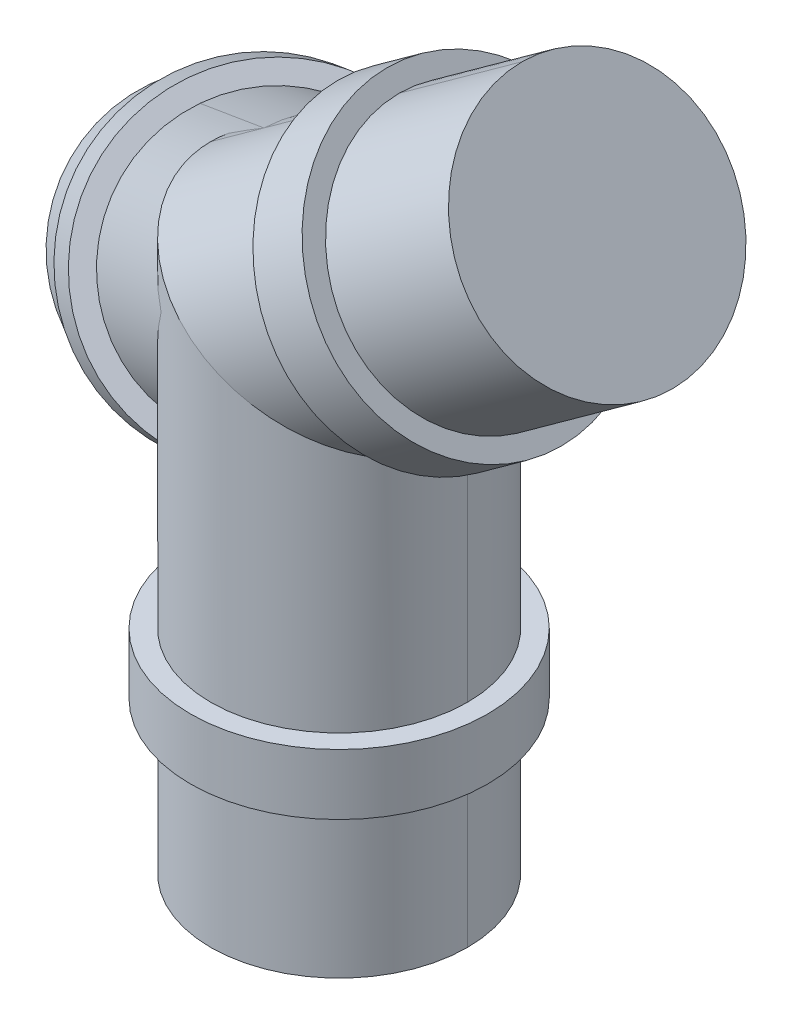
ISO-10303-21;
HEADER;
FILE_DESCRIPTION(('STEP AP214'),'2;1');
FILE_NAME('part.step','',(''),(''),'','','');
FILE_SCHEMA(('AUTOMOTIVE_DESIGN { 1 0 10303 214 1 1 1 1 }'));
ENDSEC;
DATA;
#1=APPLICATION_CONTEXT('core data for automotive mechanical design processes');
#2=APPLICATION_PROTOCOL_DEFINITION('international standard','automotive_design',2000,#1);
#3=PRODUCT_CONTEXT('',#1,'mechanical');
#4=PRODUCT('Part','Part','',(#3));
#5=PRODUCT_RELATED_PRODUCT_CATEGORY('part','',(#4));
#6=PRODUCT_DEFINITION_FORMATION('','',#4);
#7=PRODUCT_DEFINITION_CONTEXT('part definition',#1,'design');
#8=PRODUCT_DEFINITION('design','',#6,#7);
#9=PRODUCT_DEFINITION_SHAPE('','',#8);
#10=(LENGTH_UNIT() NAMED_UNIT(*) SI_UNIT(.MILLI.,.METRE.));
#11=(NAMED_UNIT(*) PLANE_ANGLE_UNIT() SI_UNIT($,.RADIAN.));
#12=(NAMED_UNIT(*) SI_UNIT($,.STERADIAN.) SOLID_ANGLE_UNIT());
#13=UNCERTAINTY_MEASURE_WITH_UNIT(LENGTH_MEASURE(1.E-05),#10,'distance_accuracy_value','');
#14=(GEOMETRIC_REPRESENTATION_CONTEXT(3) GLOBAL_UNCERTAINTY_ASSIGNED_CONTEXT((#13)) GLOBAL_UNIT_ASSIGNED_CONTEXT((#10,
#11,#12)) REPRESENTATION_CONTEXT('',''));
#15=CARTESIAN_POINT('',(0.,0.,0.));
#16=DIRECTION('',(0.,0.,1.));
#17=DIRECTION('',(1.,0.,0.));
#18=AXIS2_PLACEMENT_3D('',#15,#16,#17);
#19=CARTESIAN_POINT('',(87.4499312465951,2599.77665939185,4064.45483546757));
#20=DIRECTION('',(0.81067922839988,0.585490553844359,0.));
#21=DIRECTION('',(-0.585490553844359,0.81067922839988,0.));
#22=AXIS2_PLACEMENT_3D('',#19,#20,#21);
#23=CYLINDRICAL_SURFACE('',#22,12.7);
#24=DIRECTION('',(0.810679228399881,0.585490553844358,0.));
#25=VECTOR('',#24,1.);
#26=CARTESIAN_POINT('',(80.0142012127719,2610.07228559253,4064.45483546757));
#27=LINE('',#26,#25);
#28=CARTESIAN_POINT('',(91.6766630611999,2618.49517470528,4064.45483546757));
#29=VERTEX_POINT('',#28);
#30=CARTESIAN_POINT('',(100.183649940978,2624.63910967401,4064.45483546757));
#31=VERTEX_POINT('',#30);
#32=EDGE_CURVE('E170',#29,#31,#27,.T.);
#33=ORIENTED_EDGE('',*,*,#32,.T.);
#34=CARTESIAN_POINT('',(107.6193799748,2614.34348347333,4064.45483546757));
#35=DIRECTION('',(0.810679228399886,0.585490553844352,0.));
#36=DIRECTION('',(-0.585490553844352,0.810679228399886,0.));
#37=AXIS2_PLACEMENT_3D('',#34,#35,#36);
#38=CIRCLE('',#37,12.6999999999995);
#39=CARTESIAN_POINT('',(115.055110008623,2604.04785727265,4064.45483546757));
#40=VERTEX_POINT('',#39);
#41=EDGE_CURVE('E61',#40,#31,#38,.T.);
#42=ORIENTED_EDGE('',*,*,#41,.F.);
#43=DIRECTION('',(0.810679228399881,0.585490553844358,0.));
#44=VECTOR('',#43,1.);
#45=CARTESIAN_POINT('',(94.885661280418,2589.48103319117,4064.45483546757));
#46=LINE('',#45,#44);
#47=CARTESIAN_POINT('',(111.812393095024,2601.70589505728,4064.45483546757));
#48=VERTEX_POINT('',#47);
#49=EDGE_CURVE('E238',#48,#40,#46,.T.);
#50=ORIENTED_EDGE('',*,*,#49,.F.);
#51=CARTESIAN_POINT('',(104.743551235697,2605.32027374298,4053.07151178796));
#52=CARTESIAN_POINT('',(109.193389339506,2603.04502125929,4055.27277942896));
#53=CARTESIAN_POINT('',(111.812393095024,2601.70589505728,4059.49029738458));
#54=CARTESIAN_POINT('',(111.812393095024,2601.70589505728,4064.45483546757));
#55=(BOUNDED_CURVE() B_SPLINE_CURVE(3,(#51,#52,#53,#54),.UNSPECIFIED.,.F.,
.F.) B_SPLINE_CURVE_WITH_KNOTS((4,4),(2.03018280843935,3.1415926535898),
.UNSPECIFIED.) CURVE() GEOMETRIC_REPRESENTATION_ITEM() RATIONAL_B_SPLINE_CURVE((1.,
0.899685849938622,0.899685849938622,1.)) REPRESENTATION_ITEM(''));
#56=CARTESIAN_POINT('',(104.743551235697,2605.32027374298,4053.07151178796));
#57=VERTEX_POINT('',#56);
#58=EDGE_CURVE('E254',#57,#48,#55,.T.);
#59=ORIENTED_EDGE('',*,*,#58,.F.);
#60=CARTESIAN_POINT('',(91.6766630611999,2618.49517470528,4064.45483546757));
#61=CARTESIAN_POINT('',(93.8296687804929,2620.05012328033,4053.95500921483));
#62=CARTESIAN_POINT('',(100.187990178871,2613.63924307752,4048.41590689987));
#63=CARTESIAN_POINT('',(104.743551235697,2605.32027374298,4053.07151178796));
#64=(BOUNDED_CURVE() B_SPLINE_CURVE(3,(#60,#61,#62,#63),.UNSPECIFIED.,.F.,
.F.) B_SPLINE_CURVE_WITH_KNOTS((4,4),(4.71238898038472,6.74257178882402),
.UNSPECIFIED.) CURVE() GEOMETRIC_REPRESENTATION_ITEM() RATIONAL_B_SPLINE_CURVE((1.,
0.685028188825005,0.685028188825005,1.)) REPRESENTATION_ITEM(''));
#65=EDGE_CURVE('E239',#29,#57,#64,.T.);
#66=ORIENTED_EDGE('',*,*,#65,.F.);
#67=EDGE_LOOP('',(#33,#42,#50,#59,#66));
#68=FACE_BOUND('',#67,.T.);
#69=ADVANCED_FACE('F39',(#68),#23,.T.);
#70=CARTESIAN_POINT('',(87.4499312465951,2599.77665939185,4064.45483546757));
#71=DIRECTION('',(0.81067922839988,0.585490553844359,0.));
#72=DIRECTION('',(-0.585490553844359,0.81067922839988,0.));
#73=AXIS2_PLACEMENT_3D('',#70,#71,#72);
#74=CYLINDRICAL_SURFACE('',#73,12.7);
#75=ORIENTED_EDGE('',*,*,#49,.T.);
#76=EDGE_CURVE('E181',#31,#40,#38,.T.);
#77=ORIENTED_EDGE('',*,*,#76,.F.);
#78=ORIENTED_EDGE('',*,*,#32,.F.);
#79=DIRECTION('',(0.810679228399881,0.585490553844358,0.));
#80=VECTOR('',#79,1.);
#81=CARTESIAN_POINT('',(80.0142012127719,2610.07228559253,4064.45483546757));
#82=LINE('',#81,#80);
#83=CARTESIAN_POINT('',(86.412393095024,2614.69320195193,4064.45483546757));
#84=VERTEX_POINT('',#83);
#85=EDGE_CURVE('E295',#84,#29,#82,.T.);
#86=ORIENTED_EDGE('',*,*,#85,.F.);
#87=CARTESIAN_POINT('',(111.812393095024,2601.70589505728,4064.45483546757));
#88=CARTESIAN_POINT('',(111.812393095024,2601.70589505727,4089.85483546757));
#89=CARTESIAN_POINT('',(86.4123930950245,2614.69320195193,4089.85483546757));
#90=CARTESIAN_POINT('',(86.412393095024,2614.69320195193,4064.45483546757));
#91=(BOUNDED_CURVE() B_SPLINE_CURVE(3,(#87,#88,#89,#90),.UNSPECIFIED.,.F.,
.F.) B_SPLINE_CURVE_WITH_KNOTS((4,4),(3.1415926535898,6.28318530717959),
.UNSPECIFIED.) CURVE() GEOMETRIC_REPRESENTATION_ITEM() RATIONAL_B_SPLINE_CURVE((1.,
0.333333333333334,0.333333333333334,1.)) REPRESENTATION_ITEM(''));
#92=EDGE_CURVE('E277',#48,#84,#91,.T.);
#93=ORIENTED_EDGE('',*,*,#92,.F.);
#94=EDGE_LOOP('',(#75,#77,#78,#86,#93));
#95=FACE_BOUND('',#94,.T.);
#96=ADVANCED_FACE('F385',(#95),#74,.T.);
#97=CARTESIAN_POINT('',(99.1123930950239,2063.49288183794,4064.45483546757));
#98=DIRECTION('',(0.,1.,0.));
#99=DIRECTION('',(-1.,0.,0.));
#100=AXIS2_PLACEMENT_3D('',#97,#98,#99);
#101=CYLINDRICAL_SURFACE('',#100,12.7);
#102=DIRECTION('',(0.,1.,0.));
#103=VECTOR('',#102,1.);
#104=CARTESIAN_POINT('',(86.412393095024,2063.49288183794,4064.45483546757));
#105=LINE('',#104,#103);
#106=CARTESIAN_POINT('',(86.4123930950239,2579.36145061283,4064.45483546757));
#107=VERTEX_POINT('',#106);
#108=CARTESIAN_POINT('',(86.412393095024,2589.5213366435,4064.45483546757));
#109=VERTEX_POINT('',#108);
#110=EDGE_CURVE('E252',#107,#109,#105,.T.);
#111=ORIENTED_EDGE('',*,*,#110,.F.);
#112=CARTESIAN_POINT('',(99.1123930950238,2579.36145061283,4064.45483546757));
#113=DIRECTION('',(0.,-1.,0.));
#114=DIRECTION('',(0.,0.,-1.));
#115=AXIS2_PLACEMENT_3D('',#112,#113,#114);
#116=CIRCLE('',#115,12.7000000000001);
#117=CARTESIAN_POINT('',(111.812393095024,2579.36145061283,4064.45483546757));
#118=VERTEX_POINT('',#117);
#119=EDGE_CURVE('E191',#118,#107,#116,.T.);
#120=ORIENTED_EDGE('',*,*,#119,.F.);
#121=DIRECTION('',(0.,1.,0.));
#122=VECTOR('',#121,1.);
#123=CARTESIAN_POINT('',(111.812393095024,2063.49288183794,4064.45483546757));
#124=LINE('',#123,#122);
#125=EDGE_CURVE('E308',#118,#48,#124,.T.);
#126=ORIENTED_EDGE('',*,*,#125,.T.);
#127=ORIENTED_EDGE('',*,*,#92,.T.);
#128=DIRECTION('',(0.,1.,0.));
#129=VECTOR('',#128,1.);
#130=CARTESIAN_POINT('',(86.412393095024,2063.49288183794,4064.45483546757));
#131=LINE('',#130,#129);
#132=CARTESIAN_POINT('',(86.412393095024,2614.17776036571,4064.45483546757));
#133=VERTEX_POINT('',#132);
#134=EDGE_CURVE('E237',#133,#84,#131,.T.);
#135=ORIENTED_EDGE('',*,*,#134,.F.);
#136=CARTESIAN_POINT('',(92.0677006029631,2608.1995485046,4075.02187420566));
#137=CARTESIAN_POINT('',(88.4589341232012,2610.65328094076,4072.61602988582));
#138=CARTESIAN_POINT('',(86.4123930950239,2612.81667450189,4068.79203299555));
#139=CARTESIAN_POINT('',(86.412393095024,2614.17776036571,4064.45483546757));
#140=(BOUNDED_CURVE() B_SPLINE_CURVE(3,(#136,#137,#138,#139),.UNSPECIFIED.,.F.,
.F.) B_SPLINE_CURVE_WITH_KNOTS((4,4),(4.71238898038468,5.69518270363202),
.UNSPECIFIED.) CURVE() GEOMETRIC_REPRESENTATION_ITEM() RATIONAL_B_SPLINE_CURVE((1.,
0.921116399178628,0.921116399178628,1.)) REPRESENTATION_ITEM(''));
#141=CARTESIAN_POINT('',(92.0677006029631,2608.1995485046,4075.02187420566));
#142=VERTEX_POINT('',#141);
#143=EDGE_CURVE('E286',#142,#133,#140,.T.);
#144=ORIENTED_EDGE('',*,*,#143,.F.);
#145=CARTESIAN_POINT('',(86.412393095024,2589.5213366435,4064.45483546757));
#146=CARTESIAN_POINT('',(86.4123930950237,2593.77388752597,4068.79203299555));
#147=CARTESIAN_POINT('',(88.458934123201,2600.53315337546,4072.61602988582));
#148=CARTESIAN_POINT('',(92.0677006029631,2608.1995485046,4075.02187420566));
#149=(BOUNDED_CURVE() B_SPLINE_CURVE(3,(#145,#146,#147,#148),.UNSPECIFIED.,.F.,
.F.) B_SPLINE_CURVE_WITH_KNOTS((4,4),(3.72959525713736,4.71238898038469),
.UNSPECIFIED.) CURVE() GEOMETRIC_REPRESENTATION_ITEM() RATIONAL_B_SPLINE_CURVE((1.,
0.921116399178629,0.921116399178629,1.)) REPRESENTATION_ITEM(''));
#150=EDGE_CURVE('E270',#109,#142,#149,.T.);
#151=ORIENTED_EDGE('',*,*,#150,.F.);
#152=EDGE_LOOP('',(#111,#120,#126,#127,#135,#144,#151));
#153=FACE_BOUND('',#152,.T.);
#154=ADVANCED_FACE('F392',(#153),#101,.T.);
#155=CARTESIAN_POINT('',(99.1123930950239,2063.49288183794,4064.45483546757));
#156=DIRECTION('',(0.,1.,0.));
#157=DIRECTION('',(-1.,0.,0.));
#158=AXIS2_PLACEMENT_3D('',#155,#156,#157);
#159=CYLINDRICAL_SURFACE('',#158,12.7);
#160=ORIENTED_EDGE('',*,*,#125,.F.);
#161=CARTESIAN_POINT('',(99.1123930950238,2579.36145061283,4064.45483546757));
#162=DIRECTION('',(0.,-1.,0.));
#163=DIRECTION('',(0.,0.,-1.));
#164=AXIS2_PLACEMENT_3D('',#161,#162,#163);
#165=CIRCLE('',#164,12.7);
#166=EDGE_CURVE('E11',#118,#107,#165,.F.);
#167=ORIENTED_EDGE('',*,*,#166,.T.);
#168=ORIENTED_EDGE('',*,*,#110,.T.);
#169=CARTESIAN_POINT('',(91.406084749396,2586.96800569654,4054.3601432146));
#170=CARTESIAN_POINT('',(88.2005486928214,2584.65289632235,4056.80725587994));
#171=CARTESIAN_POINT('',(86.4123930950238,2585.56720047684,4060.42199257367));
#172=CARTESIAN_POINT('',(86.412393095024,2589.5213366435,4064.45483546757));
#173=(BOUNDED_CURVE() B_SPLINE_CURVE(3,(#169,#170,#171,#172),.UNSPECIFIED.,.F.,
.F.) B_SPLINE_CURVE_WITH_KNOTS((4,4),(2.81082229384849,3.72959525713736),
.UNSPECIFIED.) CURVE() GEOMETRIC_REPRESENTATION_ITEM() RATIONAL_B_SPLINE_CURVE((1.,
0.930883132787844,0.930883132787844,1.)) REPRESENTATION_ITEM(''));
#174=CARTESIAN_POINT('',(91.406084749396,2586.96800569654,4054.3601432146));
#175=VERTEX_POINT('',#174);
#176=EDGE_CURVE('E260',#175,#109,#173,.T.);
#177=ORIENTED_EDGE('',*,*,#176,.F.);
#178=CARTESIAN_POINT('',(104.743551235697,2605.32027374298,4053.07151178796));
#179=CARTESIAN_POINT('',(100.293713131887,2596.61747733157,4050.87024414696));
#180=CARTESIAN_POINT('',(95.3521858616709,2589.81796761096,4051.34768169798));
#181=CARTESIAN_POINT('',(91.406084749396,2586.96800569654,4054.3601432146));
#182=(BOUNDED_CURVE() B_SPLINE_CURVE(3,(#178,#179,#180,#181),.UNSPECIFIED.,.F.,
.F.) B_SPLINE_CURVE_WITH_KNOTS((4,4),(1.69941244869801,2.81082229384849),
.UNSPECIFIED.) CURVE() GEOMETRIC_REPRESENTATION_ITEM() RATIONAL_B_SPLINE_CURVE((1.,
0.899685849938618,0.899685849938618,1.)) REPRESENTATION_ITEM(''));
#183=EDGE_CURVE('E230',#57,#175,#182,.T.);
#184=ORIENTED_EDGE('',*,*,#183,.F.);
#185=ORIENTED_EDGE('',*,*,#58,.T.);
#186=EDGE_LOOP('',(#160,#167,#168,#177,#184,#185));
#187=FACE_BOUND('',#186,.T.);
#188=ADVANCED_FACE('F378',(#187),#159,.T.);
#189=CARTESIAN_POINT('',(99.1123930950239,2063.49288183794,4064.45483546757));
#190=DIRECTION('',(0.,1.,0.));
#191=DIRECTION('',(-1.,0.,0.));
#192=AXIS2_PLACEMENT_3D('',#189,#190,#191);
#193=CYLINDRICAL_SURFACE('',#192,12.7);
#194=CARTESIAN_POINT('',(86.412393095024,2614.17776036571,4064.45483546757));
#195=CARTESIAN_POINT('',(86.4123930950236,2614.34874366898,4063.90998493317));
#196=CARTESIAN_POINT('',(86.4474072311009,2614.50289149983,4063.36626063254));
#197=CARTESIAN_POINT('',(86.517290751256,2614.63956659548,4062.8259103772));
#198=(BOUNDED_CURVE() B_SPLINE_CURVE(3,(#194,#195,#196,#197),.UNSPECIFIED.,.F.,
.F.) B_SPLINE_CURVE_WITH_KNOTS((4,4),(5.69518270363202,5.82379882553517),
.UNSPECIFIED.) CURVE() GEOMETRIC_REPRESENTATION_ITEM() RATIONAL_B_SPLINE_CURVE((1.,
0.998621966105096,0.998621966105096,1.)) REPRESENTATION_ITEM(''));
#199=CARTESIAN_POINT('',(86.517290751256,2614.63956659548,4062.8259103772));
#200=VERTEX_POINT('',#199);
#201=EDGE_CURVE('E284',#133,#200,#198,.T.);
#202=ORIENTED_EDGE('',*,*,#201,.F.);
#203=ORIENTED_EDGE('',*,*,#134,.T.);
#204=CARTESIAN_POINT('',(86.412393095024,2614.69320195193,4064.45483546757));
#205=CARTESIAN_POINT('',(86.4123930950236,2614.69320195193,4063.90998493317));
#206=CARTESIAN_POINT('',(86.4474072311009,2614.67529882867,4063.36626063254));
#207=CARTESIAN_POINT('',(86.517290751256,2614.63956659548,4062.8259103772));
#208=(BOUNDED_CURVE() B_SPLINE_CURVE(3,(#204,#205,#206,#207),.UNSPECIFIED.,.F.,
.F.) B_SPLINE_CURVE_WITH_KNOTS((4,4),(0.,0.128616121903154),
.UNSPECIFIED.) CURVE() GEOMETRIC_REPRESENTATION_ITEM() RATIONAL_B_SPLINE_CURVE((1.,
0.998621966105096,0.998621966105096,1.)) REPRESENTATION_ITEM(''));
#209=EDGE_CURVE('E231',#84,#200,#208,.T.);
#210=ORIENTED_EDGE('',*,*,#209,.T.);
#211=EDGE_LOOP('',(#202,#203,#210));
#212=FACE_BOUND('',#211,.T.);
#213=ADVANCED_FACE('F41',(#212),#193,.T.);
#214=CARTESIAN_POINT('',(87.4499312465951,2599.77665939185,4064.45483546757));
#215=DIRECTION('',(0.81067922839988,0.585490553844359,0.));
#216=DIRECTION('',(-0.585490553844359,0.81067922839988,0.));
#217=AXIS2_PLACEMENT_3D('',#214,#215,#216);
#218=CYLINDRICAL_SURFACE('',#217,12.7);
#219=ORIENTED_EDGE('',*,*,#209,.F.);
#220=ORIENTED_EDGE('',*,*,#85,.T.);
#221=CARTESIAN_POINT('',(86.517290751256,2614.63956659548,4062.8259103772));
#222=CARTESIAN_POINT('',(88.2082250374125,2615.94700057767,4063.36626063254));
#223=CARTESIAN_POINT('',(89.9303890077181,2617.23397677777,4063.90998493317));
#224=CARTESIAN_POINT('',(91.6766630611999,2618.49517470528,4064.45483546757));
#225=(BOUNDED_CURVE() B_SPLINE_CURVE(3,(#221,#222,#223,#224),.UNSPECIFIED.,.F.,
.F.) B_SPLINE_CURVE_WITH_KNOTS((4,4),(4.58377285848158,4.7123889803847),
.UNSPECIFIED.) CURVE() GEOMETRIC_REPRESENTATION_ITEM() RATIONAL_B_SPLINE_CURVE((1.,
0.998621966105097,0.998621966105097,1.)) REPRESENTATION_ITEM(''));
#226=EDGE_CURVE('E278',#200,#29,#225,.T.);
#227=ORIENTED_EDGE('',*,*,#226,.F.);
#228=EDGE_LOOP('',(#219,#220,#227));
#229=FACE_BOUND('',#228,.T.);
#230=ADVANCED_FACE('F403',(#229),#218,.T.);
#231=CARTESIAN_POINT('',(-212.731067896736,2382.97927112167,3856.55919480639));
#232=DIRECTION('',(0.713185966575296,0.515078753637711,0.475457311050196));
#233=DIRECTION('',(-0.585490553844356,0.810679228399883,0.));
#234=AXIS2_PLACEMENT_3D('',#231,#232,#233);
#235=CYLINDRICAL_SURFACE('',#234,12.6999999999999);
#236=CARTESIAN_POINT('',(65.2663277366746,2583.75516796805,4041.89079189533));
#237=DIRECTION('',(0.411019198706555,-0.856460619021219,0.312311425279978));
#238=DIRECTION('',(0.712989085245753,0.51548923457792,0.475307703866343));
#239=AXIS2_PLACEMENT_3D('',#236,#237,#238);
#240=ELLIPSE('',#239,26502.1334571406,12.7000025494029);
#241=CARTESIAN_POINT('',(87.4536590639869,2594.23355473115,4041.42621225342));
#242=VERTEX_POINT('',#241);
#243=CARTESIAN_POINT('',(83.1757251706804,2591.14061891521,4038.57436409652));
#244=VERTEX_POINT('',#243);
#245=EDGE_CURVE('E214',#242,#244,#240,.F.);
#246=ORIENTED_EDGE('',*,*,#245,.T.);
#247=CARTESIAN_POINT('',(75.9582083003592,2591.4936618969,4049.01816168226));
#248=DIRECTION('',(-0.712792040185988,-0.515899597141609,-0.475157987533223));
#249=DIRECTION('',(0.586315837014237,-0.810082550896077,0.));
#250=AXIS2_PLACEMENT_3D('',#247,#248,#249);
#251=CIRCLE('',#250,12.7000050988059);
#252=CARTESIAN_POINT('',(83.1775759335632,2591.13676431139,4038.57577284798));
#253=VERTEX_POINT('',#252);
#254=EDGE_CURVE('E199',#244,#253,#251,.T.);
#255=ORIENTED_EDGE('',*,*,#254,.T.);
#256=CARTESIAN_POINT('',(75.964122109464,2591.48135279281,4049.02265481053));
#257=DIRECTION('',(-0.712792040185988,-0.515899597141609,-0.475157987533223));
#258=DIRECTION('',(0.411360820730985,-0.856213494736549,0.312539160104069));
#259=AXIS2_PLACEMENT_3D('',#256,#257,#258);
#260=ELLIPSE('',#259,12.7000058328371,12.6999999999999);
#261=CARTESIAN_POINT('',(83.4079683660409,2581.19158830856,4049.0280656257));
#262=VERTEX_POINT('',#261);
#263=EDGE_CURVE('E219',#262,#253,#260,.F.);
#264=ORIENTED_EDGE('',*,*,#263,.F.);
#265=DIRECTION('',(0.713185966575295,0.515078753637713,0.475457311050196));
#266=VECTOR('',#265,1.);
#267=CARTESIAN_POINT('',(-205.295337862914,2372.68364492099,3856.55919480639));
#268=LINE('',#267,#266);
#269=CARTESIAN_POINT('',(72.7101739541464,2573.46540345553,4041.89620268443));
#270=VERTEX_POINT('',#269);
#271=EDGE_CURVE('E302',#270,#262,#268,.T.);
#272=ORIENTED_EDGE('',*,*,#271,.F.);
#273=CARTESIAN_POINT('',(65.2663276975694,2583.75516793977,4041.89079186926));
#274=DIRECTION('',(0.712792040185988,0.515899597141609,0.475157987533223));
#275=DIRECTION('',(0.411360820730995,-0.856213494736549,0.312539160104054));
#276=AXIS2_PLACEMENT_3D('',#273,#274,#275);
#277=ELLIPSE('',#276,12.7000058328371,12.6999999999999);
#278=CARTESIAN_POINT('',(57.8224814409909,2594.04493242402,4041.88538105409));
#279=VERTEX_POINT('',#278);
#280=EDGE_CURVE('E224',#279,#270,#277,.F.);
#281=ORIENTED_EDGE('',*,*,#280,.F.);
#282=DIRECTION('',(0.713185966575295,0.515078753637713,0.475457311050196));
#283=VECTOR('',#282,1.);
#284=CARTESIAN_POINT('',(-220.16679793056,2393.27489732234,3856.55919480639));
#285=LINE('',#284,#283);
#286=EDGE_CURVE('E247',#279,#29,#285,.T.);
#287=ORIENTED_EDGE('',*,*,#286,.T.);
#288=ORIENTED_EDGE('',*,*,#65,.T.);
#289=ORIENTED_EDGE('',*,*,#183,.T.);
#290=CARTESIAN_POINT('',(87.6870861307987,2584.28206224978,4051.8808108022));
#291=VERTEX_POINT('',#290);
#292=EDGE_CURVE('E269',#291,#175,#268,.T.);
#293=ORIENTED_EDGE('',*,*,#292,.F.);
#294=CARTESIAN_POINT('',(80.2432398742218,2594.57182673402,4051.87539998703));
#295=DIRECTION('',(-0.712792040185988,-0.515899597141609,-0.475157987533223));
#296=DIRECTION('',(0.411360820730985,-0.856213494736549,0.312539160104069));
#297=AXIS2_PLACEMENT_3D('',#294,#295,#296);
#298=ELLIPSE('',#297,12.7000058328371,12.6999999999999);
#299=CARTESIAN_POINT('',(87.4549815820716,2594.23080007612,4041.42721917126));
#300=VERTEX_POINT('',#299);
#301=EDGE_CURVE('E221',#291,#300,#298,.F.);
#302=ORIENTED_EDGE('',*,*,#301,.T.);
#303=CARTESIAN_POINT('',(80.2349605414751,2594.58905947975,4051.86910960746));
#304=DIRECTION('',(-0.712792040185988,-0.515899597141609,-0.475157987533223));
#305=DIRECTION('',(0.586315837014237,-0.810082550896077,0.));
#306=AXIS2_PLACEMENT_3D('',#303,#304,#305);
#307=CIRCLE('',#306,12.7000050988059);
#308=EDGE_CURVE('E206',#242,#300,#307,.T.);
#309=ORIENTED_EDGE('',*,*,#308,.F.);
#310=EDGE_LOOP('',(#246,#255,#264,#272,#281,#287,#288,#289,#293,#302,#309));
#311=FACE_BOUND('',#310,.T.);
#312=ADVANCED_FACE('F404',(#311),#235,.T.);
#313=CARTESIAN_POINT('',(-212.731067896736,2382.97927112167,3856.55919480639));
#314=DIRECTION('',(0.713185966575296,0.515078753637711,0.475457311050196));
#315=DIRECTION('',(-0.585490553844356,0.810679228399883,0.));
#316=AXIS2_PLACEMENT_3D('',#313,#314,#315);
#317=CYLINDRICAL_SURFACE('',#316,12.6999999999999);
#318=CARTESIAN_POINT('',(65.2663276975694,2583.75516793977,4041.89079186926));
#319=DIRECTION('',(0.712792040185988,0.515899597141609,0.475157987533223));
#320=DIRECTION('',(0.411360820730995,-0.856213494736549,0.312539160104054));
#321=AXIS2_PLACEMENT_3D('',#318,#319,#320);
#322=ELLIPSE('',#321,12.7000058328371,12.6999999999999);
#323=EDGE_CURVE('E347',#270,#279,#322,.F.);
#324=ORIENTED_EDGE('',*,*,#323,.F.);
#325=ORIENTED_EDGE('',*,*,#271,.T.);
#326=CARTESIAN_POINT('',(75.964122109464,2591.48135279281,4049.02265481053));
#327=DIRECTION('',(-0.712792040185988,-0.515899597141609,-0.475157987533223));
#328=DIRECTION('',(0.411360820730985,-0.856213494736549,0.312539160104069));
#329=AXIS2_PLACEMENT_3D('',#326,#327,#328);
#330=ELLIPSE('',#329,12.7000058328371,12.6999999999999);
#331=CARTESIAN_POINT('',(68.7484583545522,2591.83054106227,4059.46785773636));
#332=VERTEX_POINT('',#331);
#333=EDGE_CURVE('E352',#332,#262,#330,.F.);
#334=ORIENTED_EDGE('',*,*,#333,.F.);
#335=CARTESIAN_POINT('',(68.746605237785,2591.83439577732,4059.46645239524));
#336=VERTEX_POINT('',#335);
#337=EDGE_CURVE('E207',#332,#336,#251,.T.);
#338=ORIENTED_EDGE('',*,*,#337,.T.);
#339=CARTESIAN_POINT('',(65.2663277366746,2583.75516796805,4041.89079189533));
#340=DIRECTION('',(0.411019198706555,-0.856460619021219,0.312311425279978));
#341=DIRECTION('',(0.712989085245753,0.51548923457792,0.475307703866343));
#342=AXIS2_PLACEMENT_3D('',#339,#340,#341);
#343=ELLIPSE('',#342,26502.1334571406,12.7000025494029);
#344=CARTESIAN_POINT('',(73.0245413498095,2594.92733148658,4062.31829733963));
#345=VERTEX_POINT('',#344);
#346=EDGE_CURVE('E349',#336,#345,#343,.F.);
#347=ORIENTED_EDGE('',*,*,#346,.T.);
#348=CARTESIAN_POINT('',(73.0258657793295,2594.92457673929,4062.31930149027));
#349=VERTEX_POINT('',#348);
#350=EDGE_CURVE('E202',#349,#345,#307,.T.);
#351=ORIENTED_EDGE('',*,*,#350,.F.);
#352=CARTESIAN_POINT('',(80.2432398742218,2594.57182673402,4051.87539998703));
#353=DIRECTION('',(-0.712792040185988,-0.515899597141609,-0.475157987533223));
#354=DIRECTION('',(0.411360820730985,-0.856213494736549,0.312539160104069));
#355=AXIS2_PLACEMENT_3D('',#352,#353,#354);
#356=ELLIPSE('',#355,12.7000058328371,12.6999999999999);
#357=EDGE_CURVE('E354',#349,#291,#356,.F.);
#358=ORIENTED_EDGE('',*,*,#357,.T.);
#359=ORIENTED_EDGE('',*,*,#292,.T.);
#360=ORIENTED_EDGE('',*,*,#176,.T.);
#361=ORIENTED_EDGE('',*,*,#150,.T.);
#362=ORIENTED_EDGE('',*,*,#143,.T.);
#363=ORIENTED_EDGE('',*,*,#201,.T.);
#364=ORIENTED_EDGE('',*,*,#226,.T.);
#365=ORIENTED_EDGE('',*,*,#286,.F.);
#366=EDGE_LOOP('',(#324,#325,#334,#338,#347,#351,#358,#359,#360,#361,#362,#363,#364,#365));
#367=FACE_BOUND('',#366,.T.);
#368=ADVANCED_FACE('F407',(#367),#317,.T.);
#369=CARTESIAN_POINT('',(19.0805690285623,2608.43858919467,4084.37492261605));
#370=DIRECTION('',(0.712792040185988,0.515899597141609,0.475157987533223));
#371=DIRECTION('',(-0.586315837014237,0.810082550896077,0.));
#372=AXIS2_PLACEMENT_3D('',#369,#370,#371);
#373=PLANE('',#372);
#374=ORIENTED_EDGE('',*,*,#280,.T.);
#375=ORIENTED_EDGE('',*,*,#323,.T.);
#376=EDGE_LOOP('',(#374,#375));
#377=FACE_BOUND('',#376,.T.);
#378=ADVANCED_FACE('F413',(#377),#373,.F.);
#379=CARTESIAN_POINT('',(80.2349605414751,2594.58905947975,4051.86910960746));
#380=DIRECTION('',(-0.712792040185988,-0.515899597141609,-0.475157987533223));
#381=DIRECTION('',(0.586315837014237,-0.810082550896077,0.));
#382=AXIS2_PLACEMENT_3D('',#379,#380,#381);
#383=CYLINDRICAL_SURFACE('',#382,14.700005098806);
#384=CARTESIAN_POINT('',(80.2349605414751,2594.58905947975,4051.86910960746));
#385=DIRECTION('',(-0.712792040185988,-0.515899597141609,-0.475157987533223));
#386=DIRECTION('',(0.586315837014237,-0.810082550896077,0.));
#387=AXIS2_PLACEMENT_3D('',#384,#385,#386);
#388=CIRCLE('',#387,14.700005098806);
#389=CARTESIAN_POINT('',(88.8538063350951,2582.68084185112,4051.86910960746));
#390=VERTEX_POINT('',#389);
#391=EDGE_CURVE('E211',#390,#390,#388,.T.);
#392=ORIENTED_EDGE('',*,*,#391,.T.);
#393=EDGE_LOOP('',(#392));
#394=FACE_BOUND('',#393,.T.);
#395=CARTESIAN_POINT('',(75.9582083003592,2591.4936618969,4049.01816168226));
#396=DIRECTION('',(-0.712792040185988,-0.515899597141609,-0.475157987533223));
#397=DIRECTION('',(0.586315837014237,-0.810082550896077,0.));
#398=AXIS2_PLACEMENT_3D('',#395,#396,#397);
#399=CIRCLE('',#398,14.700005098806);
#400=CARTESIAN_POINT('',(84.5770540939791,2579.58544426827,4049.01816168226));
#401=VERTEX_POINT('',#400);
#402=EDGE_CURVE('E204',#401,#401,#399,.T.);
#403=ORIENTED_EDGE('',*,*,#402,.F.);
#404=EDGE_LOOP('',(#403));
#405=FACE_BOUND('',#404,.T.);
#406=ADVANCED_FACE('F419',(#394,#405),#383,.T.);
#407=CARTESIAN_POINT('',(80.2349605414751,2594.58905947975,4051.86910960746));
#408=DIRECTION('',(-0.712792040185988,-0.515899597141609,-0.475157987533223));
#409=DIRECTION('',(0.586315837014237,-0.810082550896077,0.));
#410=AXIS2_PLACEMENT_3D('',#407,#408,#409);
#411=PLANE('',#410);
#412=ORIENTED_EDGE('',*,*,#301,.F.);
#413=ORIENTED_EDGE('',*,*,#357,.F.);
#414=ORIENTED_EDGE('',*,*,#350,.T.);
#415=EDGE_CURVE('E205',#345,#242,#307,.T.);
#416=ORIENTED_EDGE('',*,*,#415,.T.);
#417=ORIENTED_EDGE('',*,*,#308,.T.);
#418=EDGE_LOOP('',(#412,#413,#414,#416,#417));
#419=FACE_BOUND('',#418,.T.);
#420=ORIENTED_EDGE('',*,*,#391,.F.);
#421=EDGE_LOOP('',(#420));
#422=FACE_BOUND('',#421,.T.);
#423=ADVANCED_FACE('F441',(#419,#422),#411,.F.);
#424=CARTESIAN_POINT('',(75.9582083003592,2591.4936618969,4049.01816168226));
#425=DIRECTION('',(-0.712792040185988,-0.515899597141609,-0.475157987533223));
#426=DIRECTION('',(0.586315837014237,-0.810082550896077,0.));
#427=AXIS2_PLACEMENT_3D('',#424,#425,#426);
#428=PLANE('',#427);
#429=ORIENTED_EDGE('',*,*,#333,.T.);
#430=ORIENTED_EDGE('',*,*,#263,.T.);
#431=ORIENTED_EDGE('',*,*,#254,.F.);
#432=EDGE_CURVE('E210',#336,#244,#251,.T.);
#433=ORIENTED_EDGE('',*,*,#432,.F.);
#434=ORIENTED_EDGE('',*,*,#337,.F.);
#435=EDGE_LOOP('',(#429,#430,#431,#433,#434));
#436=FACE_BOUND('',#435,.T.);
#437=ORIENTED_EDGE('',*,*,#402,.T.);
#438=EDGE_LOOP('',(#437));
#439=FACE_BOUND('',#438,.T.);
#440=ADVANCED_FACE('F430',(#436,#439),#428,.T.);
#441=CARTESIAN_POINT('',(80.2349605414751,2594.58905947975,4051.86910960746));
#442=DIRECTION('',(-0.712792040185988,-0.515899597141609,-0.475157987533223));
#443=DIRECTION('',(0.586315837014237,-0.810082550896077,0.));
#444=AXIS2_PLACEMENT_3D('',#441,#442,#443);
#445=CYLINDRICAL_SURFACE('',#444,12.7000050988059);
#446=ORIENTED_EDGE('',*,*,#245,.F.);
#447=ORIENTED_EDGE('',*,*,#415,.F.);
#448=ORIENTED_EDGE('',*,*,#346,.F.);
#449=ORIENTED_EDGE('',*,*,#432,.T.);
#450=EDGE_LOOP('',(#446,#447,#448,#449));
#451=FACE_BOUND('',#450,.T.);
#452=ADVANCED_FACE('F437',(#451),#445,.F.);
#453=CARTESIAN_POINT('',(99.1123930950238,2579.36145061283,4064.45483546757));
#454=DIRECTION('',(0.,-1.,0.));
#455=DIRECTION('',(0.,0.,-1.));
#456=AXIS2_PLACEMENT_3D('',#453,#454,#455);
#457=CYLINDRICAL_SURFACE('',#456,14.6999999999999);
#458=CARTESIAN_POINT('',(99.1123930950238,2579.36145061283,4064.45483546757));
#459=DIRECTION('',(0.,-1.,0.));
#460=DIRECTION('',(0.,0.,-1.));
#461=AXIS2_PLACEMENT_3D('',#458,#459,#460);
#462=CIRCLE('',#461,14.6999999999999);
#463=CARTESIAN_POINT('',(99.1123930950238,2579.36145061283,4049.75483546757));
#464=VERTEX_POINT('',#463);
#465=EDGE_CURVE('E196',#464,#464,#462,.T.);
#466=ORIENTED_EDGE('',*,*,#465,.T.);
#467=EDGE_LOOP('',(#466));
#468=FACE_BOUND('',#467,.T.);
#469=CARTESIAN_POINT('',(99.1123930950238,2573.36145061283,4064.45483546757));
#470=DIRECTION('',(0.,-1.,0.));
#471=DIRECTION('',(0.,0.,-1.));
#472=AXIS2_PLACEMENT_3D('',#469,#470,#471);
#473=CIRCLE('',#472,14.6999999999999);
#474=CARTESIAN_POINT('',(99.1123930950238,2573.36145061283,4049.75483546757));
#475=VERTEX_POINT('',#474);
#476=EDGE_CURVE('E193',#475,#475,#473,.T.);
#477=ORIENTED_EDGE('',*,*,#476,.F.);
#478=EDGE_LOOP('',(#477));
#479=FACE_BOUND('',#478,.T.);
#480=ADVANCED_FACE('F467',(#468,#479),#457,.T.);
#481=CARTESIAN_POINT('',(99.1123930950238,2579.36145061283,4064.45483546757));
#482=DIRECTION('',(0.,-1.,0.));
#483=DIRECTION('',(0.,0.,-1.));
#484=AXIS2_PLACEMENT_3D('',#481,#482,#483);
#485=PLANE('',#484);
#486=ORIENTED_EDGE('',*,*,#119,.T.);
#487=ORIENTED_EDGE('',*,*,#166,.F.);
#488=EDGE_LOOP('',(#486,#487));
#489=FACE_BOUND('',#488,.T.);
#490=ORIENTED_EDGE('',*,*,#465,.F.);
#491=EDGE_LOOP('',(#490));
#492=FACE_BOUND('',#491,.T.);
#493=ADVANCED_FACE('F380',(#489,#492),#485,.F.);
#494=CARTESIAN_POINT('',(99.1123930950238,2573.36145061283,4064.45483546757));
#495=DIRECTION('',(0.,-1.,0.));
#496=DIRECTION('',(0.,0.,-1.));
#497=AXIS2_PLACEMENT_3D('',#494,#495,#496);
#498=PLANE('',#497);
#499=CARTESIAN_POINT('',(99.1123930950238,2573.36145061283,4064.45483546757));
#500=DIRECTION('',(0.,-1.,0.));
#501=DIRECTION('',(0.,0.,-1.));
#502=AXIS2_PLACEMENT_3D('',#499,#500,#501);
#503=CIRCLE('',#502,12.7000000000001);
#504=CARTESIAN_POINT('',(111.812393095024,2573.36145061283,4064.45483546757));
#505=VERTEX_POINT('',#504);
#506=CARTESIAN_POINT('',(86.4123930950237,2573.36145061283,4064.45483546757));
#507=VERTEX_POINT('',#506);
#508=EDGE_CURVE('E187',#505,#507,#503,.T.);
#509=ORIENTED_EDGE('',*,*,#508,.F.);
#510=CARTESIAN_POINT('',(99.1123930950238,2573.36145061283,4064.45483546757));
#511=DIRECTION('',(0.,-1.,0.));
#512=DIRECTION('',(0.,0.,-1.));
#513=AXIS2_PLACEMENT_3D('',#510,#511,#512);
#514=CIRCLE('',#513,12.7);
#515=EDGE_CURVE('E47',#505,#507,#514,.F.);
#516=ORIENTED_EDGE('',*,*,#515,.T.);
#517=EDGE_LOOP('',(#509,#516));
#518=FACE_BOUND('',#517,.T.);
#519=ORIENTED_EDGE('',*,*,#476,.T.);
#520=EDGE_LOOP('',(#519));
#521=FACE_BOUND('',#520,.T.);
#522=ADVANCED_FACE('F359',(#518,#521),#498,.T.);
#523=CARTESIAN_POINT('',(142.876471400714,2558.36145061283,4077.79892104388));
#524=DIRECTION('',(0.,1.,0.));
#525=DIRECTION('',(0.,0.,1.));
#526=AXIS2_PLACEMENT_3D('',#523,#524,#525);
#527=PLANE('',#526);
#528=CARTESIAN_POINT('',(99.1123930950238,2558.36145061283,4064.45483546757));
#529=DIRECTION('',(0.,1.,0.));
#530=DIRECTION('',(0.,0.,1.));
#531=AXIS2_PLACEMENT_3D('',#528,#529,#530);
#532=CIRCLE('',#531,12.7);
#533=CARTESIAN_POINT('',(111.812393095024,2558.36145061283,4064.45483546757));
#534=VERTEX_POINT('',#533);
#535=CARTESIAN_POINT('',(86.4123930950239,2558.36145061283,4064.45483546757));
#536=VERTEX_POINT('',#535);
#537=EDGE_CURVE('E226',#534,#536,#532,.F.);
#538=ORIENTED_EDGE('',*,*,#537,.T.);
#539=CARTESIAN_POINT('',(99.1123930950238,2558.36145061283,4064.45483546757));
#540=DIRECTION('',(0.,1.,0.));
#541=DIRECTION('',(0.,0.,1.));
#542=AXIS2_PLACEMENT_3D('',#539,#540,#541);
#543=CIRCLE('',#542,12.7);
#544=EDGE_CURVE('E305',#536,#534,#543,.F.);
#545=ORIENTED_EDGE('',*,*,#544,.T.);
#546=EDGE_LOOP('',(#538,#545));
#547=FACE_BOUND('',#546,.T.);
#548=ADVANCED_FACE('F370',(#547),#527,.F.);
#549=ORIENTED_EDGE('',*,*,#515,.F.);
#550=EDGE_CURVE('E285',#534,#505,#124,.T.);
#551=ORIENTED_EDGE('',*,*,#550,.F.);
#552=ORIENTED_EDGE('',*,*,#544,.F.);
#553=EDGE_CURVE('E171',#536,#507,#105,.T.);
#554=ORIENTED_EDGE('',*,*,#553,.T.);
#555=EDGE_LOOP('',(#549,#551,#552,#554));
#556=FACE_BOUND('',#555,.T.);
#557=ADVANCED_FACE('F363',(#556),#159,.T.);
#558=ORIENTED_EDGE('',*,*,#508,.T.);
#559=ORIENTED_EDGE('',*,*,#553,.F.);
#560=ORIENTED_EDGE('',*,*,#537,.F.);
#561=ORIENTED_EDGE('',*,*,#550,.T.);
#562=EDGE_LOOP('',(#558,#559,#560,#561));
#563=FACE_BOUND('',#562,.T.);
#564=ADVANCED_FACE('F368',(#563),#101,.T.);
#565=CARTESIAN_POINT('',(107.6193799748,2614.34348347333,4064.45483546757));
#566=DIRECTION('',(0.810679228399885,0.585490553844352,0.));
#567=DIRECTION('',(-0.585490553844352,0.810679228399886,0.));
#568=AXIS2_PLACEMENT_3D('',#565,#566,#567);
#569=CYLINDRICAL_SURFACE('',#568,14.6999999999995);
#570=CARTESIAN_POINT('',(107.6193799748,2614.34348347333,4064.45483546757));
#571=DIRECTION('',(0.810679228399886,0.585490553844352,0.));
#572=DIRECTION('',(-0.585490553844352,0.810679228399886,0.));
#573=AXIS2_PLACEMENT_3D('',#570,#571,#572);
#574=CIRCLE('',#573,14.6999999999995);
#575=CARTESIAN_POINT('',(99.0126688332887,2626.26046813081,4064.45483546757));
#576=VERTEX_POINT('',#575);
#577=EDGE_CURVE('E184',#576,#576,#574,.T.);
#578=ORIENTED_EDGE('',*,*,#577,.T.);
#579=EDGE_LOOP('',(#578));
#580=FACE_BOUND('',#579,.T.);
#581=CARTESIAN_POINT('',(112.4834553452,2617.8564267964,4064.45483546757));
#582=DIRECTION('',(0.810679228399886,0.585490553844352,0.));
#583=DIRECTION('',(-0.585490553844352,0.810679228399886,0.));
#584=AXIS2_PLACEMENT_3D('',#581,#582,#583);
#585=CIRCLE('',#584,14.6999999999995);
#586=CARTESIAN_POINT('',(103.876744203688,2629.77341145388,4064.45483546757));
#587=VERTEX_POINT('',#586);
#588=EDGE_CURVE('E188',#587,#587,#585,.T.);
#589=ORIENTED_EDGE('',*,*,#588,.F.);
#590=EDGE_LOOP('',(#589));
#591=FACE_BOUND('',#590,.T.);
#592=ADVANCED_FACE('F411',(#580,#591),#569,.T.);
#593=CARTESIAN_POINT('',(107.6193799748,2614.34348347333,4064.45483546757));
#594=DIRECTION('',(0.810679228399886,0.585490553844352,0.));
#595=DIRECTION('',(-0.585490553844352,0.810679228399886,0.));
#596=AXIS2_PLACEMENT_3D('',#593,#594,#595);
#597=PLANE('',#596);
#598=ORIENTED_EDGE('',*,*,#76,.T.);
#599=ORIENTED_EDGE('',*,*,#41,.T.);
#600=EDGE_LOOP('',(#598,#599));
#601=FACE_BOUND('',#600,.T.);
#602=ORIENTED_EDGE('',*,*,#577,.F.);
#603=EDGE_LOOP('',(#602));
#604=FACE_BOUND('',#603,.T.);
#605=ADVANCED_FACE('F462',(#601,#604),#597,.F.);
#606=CARTESIAN_POINT('',(112.4834553452,2617.8564267964,4064.45483546757));
#607=DIRECTION('',(0.810679228399886,0.585490553844352,0.));
#608=DIRECTION('',(-0.585490553844352,0.810679228399886,0.));
#609=AXIS2_PLACEMENT_3D('',#606,#607,#608);
#610=PLANE('',#609);
#611=CARTESIAN_POINT('',(112.4834553452,2617.8564267964,4064.45483546757));
#612=DIRECTION('',(0.810679228399886,0.585490553844352,0.));
#613=DIRECTION('',(-0.585490553844352,0.810679228399886,0.));
#614=AXIS2_PLACEMENT_3D('',#611,#612,#613);
#615=CIRCLE('',#614,12.6999999999995);
#616=CARTESIAN_POINT('',(105.047725311377,2628.15205299708,4064.45483546757));
#617=VERTEX_POINT('',#616);
#618=CARTESIAN_POINT('',(119.919185379023,2607.56080059572,4064.45483546757));
#619=VERTEX_POINT('',#618);
#620=EDGE_CURVE('E54',#617,#619,#615,.T.);
#621=ORIENTED_EDGE('',*,*,#620,.F.);
#622=EDGE_CURVE('E174',#619,#617,#615,.T.);
#623=ORIENTED_EDGE('',*,*,#622,.F.);
#624=EDGE_LOOP('',(#621,#623));
#625=FACE_BOUND('',#624,.T.);
#626=ORIENTED_EDGE('',*,*,#588,.T.);
#627=EDGE_LOOP('',(#626));
#628=FACE_BOUND('',#627,.T.);
#629=ADVANCED_FACE('F179',(#625,#628),#610,.T.);
#630=CARTESIAN_POINT('',(64.7175066545064,2709.61343649641,4077.79892104388));
#631=DIRECTION('',(-0.810679228399885,-0.585490553844352,0.));
#632=DIRECTION('',(0.585490553844352,-0.810679228399885,0.));
#633=AXIS2_PLACEMENT_3D('',#630,#631,#632);
#634=PLANE('',#633);
#635=CARTESIAN_POINT('',(124.643643771198,2626.63878510406,4064.45483546757));
#636=DIRECTION('',(-0.810679228399885,-0.585490553844352,0.));
#637=DIRECTION('',(0.585490553844352,-0.810679228399885,0.));
#638=AXIS2_PLACEMENT_3D('',#635,#636,#637);
#639=CIRCLE('',#638,12.7);
#640=CARTESIAN_POINT('',(132.079373805021,2616.34315890338,4064.45483546757));
#641=VERTEX_POINT('',#640);
#642=CARTESIAN_POINT('',(117.207913737375,2636.93441130474,4064.45483546757));
#643=VERTEX_POINT('',#642);
#644=EDGE_CURVE('E228',#641,#643,#639,.F.);
#645=ORIENTED_EDGE('',*,*,#644,.T.);
#646=CARTESIAN_POINT('',(124.643643771198,2626.63878510406,4064.45483546757));
#647=DIRECTION('',(-0.810679228399885,-0.585490553844352,0.));
#648=DIRECTION('',(0.585490553844352,-0.810679228399885,0.));
#649=AXIS2_PLACEMENT_3D('',#646,#647,#648);
#650=CIRCLE('',#649,12.7);
#651=EDGE_CURVE('E166',#643,#641,#650,.F.);
#652=ORIENTED_EDGE('',*,*,#651,.T.);
#653=EDGE_LOOP('',(#645,#652));
#654=FACE_BOUND('',#653,.T.);
#655=ADVANCED_FACE('F398',(#654),#634,.F.);
#656=ORIENTED_EDGE('',*,*,#620,.T.);
#657=EDGE_CURVE('E176',#619,#641,#46,.T.);
#658=ORIENTED_EDGE('',*,*,#657,.T.);
#659=ORIENTED_EDGE('',*,*,#651,.F.);
#660=EDGE_CURVE('E162',#617,#643,#27,.T.);
#661=ORIENTED_EDGE('',*,*,#660,.F.);
#662=EDGE_LOOP('',(#656,#658,#659,#661));
#663=FACE_BOUND('',#662,.T.);
#664=ADVANCED_FACE('F164',(#663),#74,.T.);
#665=ORIENTED_EDGE('',*,*,#622,.T.);
#666=ORIENTED_EDGE('',*,*,#660,.T.);
#667=ORIENTED_EDGE('',*,*,#644,.F.);
#668=ORIENTED_EDGE('',*,*,#657,.F.);
#669=EDGE_LOOP('',(#665,#666,#667,#668));
#670=FACE_BOUND('',#669,.T.);
#671=ADVANCED_FACE('F175',(#670),#23,.T.);
#672=CLOSED_SHELL('',(#69,#96,#154,#188,#213,#230,#312,#368,#378,#406,#423,#440,#452,#480,#493,
#522,#548,#557,#564,#592,#605,#629,#655,#664,#671));
#673=MANIFOLD_SOLID_BREP('B2',#672);
#674=ADVANCED_BREP_SHAPE_REPRESENTATION('',(#18,#673),#14);
#675=SHAPE_DEFINITION_REPRESENTATION(#9,#674);
ENDSEC;
END-ISO-10303-21;
